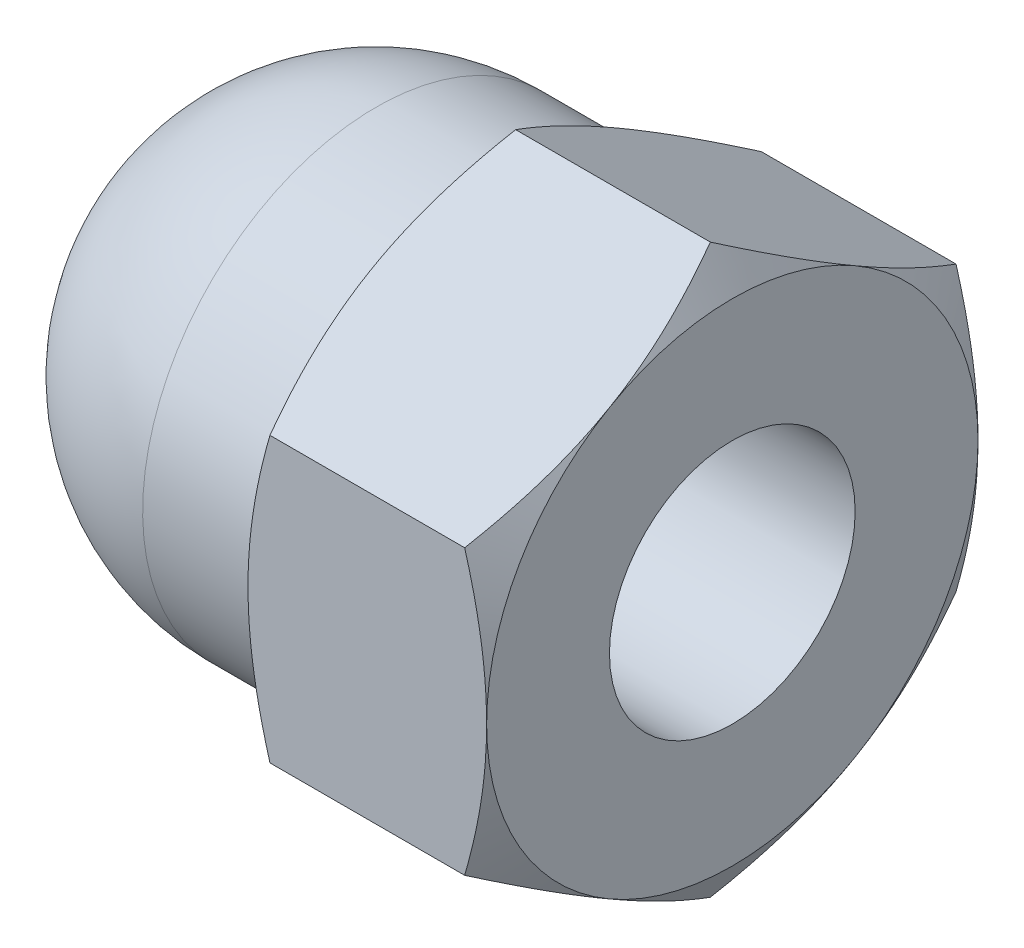
ISO-10303-21;
HEADER;
FILE_DESCRIPTION(('STEP AP214'),'2;1');
FILE_NAME('part.step','',(''),(''),'','','');
FILE_SCHEMA(('AUTOMOTIVE_DESIGN { 1 0 10303 214 1 1 1 1 }'));
ENDSEC;
DATA;
#1=APPLICATION_CONTEXT('core data for automotive mechanical design processes');
#2=APPLICATION_PROTOCOL_DEFINITION('international standard','automotive_design',2000,#1);
#3=PRODUCT_CONTEXT('',#1,'mechanical');
#4=PRODUCT('Part','Part','',(#3));
#5=PRODUCT_RELATED_PRODUCT_CATEGORY('part','',(#4));
#6=PRODUCT_DEFINITION_FORMATION('','',#4);
#7=PRODUCT_DEFINITION_CONTEXT('part definition',#1,'design');
#8=PRODUCT_DEFINITION('design','',#6,#7);
#9=PRODUCT_DEFINITION_SHAPE('','',#8);
#10=(LENGTH_UNIT() NAMED_UNIT(*) SI_UNIT(.MILLI.,.METRE.));
#11=(NAMED_UNIT(*) PLANE_ANGLE_UNIT() SI_UNIT($,.RADIAN.));
#12=(NAMED_UNIT(*) SI_UNIT($,.STERADIAN.) SOLID_ANGLE_UNIT());
#13=UNCERTAINTY_MEASURE_WITH_UNIT(LENGTH_MEASURE(1.E-05),#10,'distance_accuracy_value','');
#14=(GEOMETRIC_REPRESENTATION_CONTEXT(3) GLOBAL_UNCERTAINTY_ASSIGNED_CONTEXT((#13)) GLOBAL_UNIT_ASSIGNED_CONTEXT((#10,
#11,#12)) REPRESENTATION_CONTEXT('',''));
#15=CARTESIAN_POINT('',(0.,0.,0.));
#16=DIRECTION('',(0.,0.,1.));
#17=DIRECTION('',(1.,0.,0.));
#18=AXIS2_PLACEMENT_3D('',#15,#16,#17);
#19=CARTESIAN_POINT('',(-12.,2.88675134594813,-5.));
#20=DIRECTION('',(0.,0.866025403784438,-0.5));
#21=DIRECTION('',(0.,0.5,0.866025403784439));
#22=AXIS2_PLACEMENT_3D('',#19,#20,#21);
#23=PLANE('',#22);
#24=DIRECTION('',(1.,0.,0.));
#25=VECTOR('',#24,1.);
#26=CARTESIAN_POINT('',(-12.,5.77350269189626,0.));
#27=LINE('',#26,#25);
#28=CARTESIAN_POINT('',(-4.4090804453174,5.77350269189626,0.));
#29=VERTEX_POINT('',#28);
#30=CARTESIAN_POINT('',(-0.446581987385199,5.77350269189626,0.));
#31=VERTEX_POINT('',#30);
#32=EDGE_CURVE('E288',#29,#31,#27,.T.);
#33=ORIENTED_EDGE('',*,*,#32,.T.);
#34=CARTESIAN_POINT('',(-0.446648656051826,5.7736181619501,0.000199999999999086));
#35=CARTESIAN_POINT('',(-0.373386567637632,5.64675433465071,-0.219534594525186));
#36=CARTESIAN_POINT('',(-0.30675132191809,5.5188054379059,-0.441148584459581));
#37=CARTESIAN_POINT('',(-0.19043899101081,5.26069210252318,-0.888213995453514));
#38=CARTESIAN_POINT('',(-0.140803049915789,5.13052307794721,-1.11367335959077));
#39=CARTESIAN_POINT('',(-0.0635510254186985,4.87177839004641,-1.56183230522351));
#40=CARTESIAN_POINT('',(-0.0354203782834903,4.74324302208387,-1.78446209310419));
#41=CARTESIAN_POINT('',(-0.0101949219536855,4.54998783160116,-2.11918990184664));
#42=CARTESIAN_POINT('',(-0.00461345976948486,4.48552534905128,-2.23084219680506));
#43=CARTESIAN_POINT('',(0.000797783248528913,4.35654081066911,-2.4542499706738));
#44=CARTESIAN_POINT('',(0.000627741741795695,4.2920187567385,-2.56600544629031));
#45=CARTESIAN_POINT('',(-0.00775363179203751,4.11524635305245,-2.87218423085064));
#46=CARTESIAN_POINT('',(-0.0218297718972525,4.00305457769146,-3.06650608596721));
#47=CARTESIAN_POINT('',(-0.0664652571094314,3.77941563226458,-3.45386010199771));
#48=CARTESIAN_POINT('',(-0.0970398601475082,3.66796924828419,-3.64689090137157));
#49=CARTESIAN_POINT('',(-0.173468493621163,3.44387972423144,-4.03502534247485));
#50=CARTESIAN_POINT('',(-0.219646378878679,3.3312648659868,-4.23007999864174));
#51=CARTESIAN_POINT('',(-0.324451794491932,3.10771464157941,-4.61728034535877));
#52=CARTESIAN_POINT('',(-0.383054703437371,2.99677641204847,-4.80943099540809));
#53=CARTESIAN_POINT('',(-0.446648656051825,2.88663587589429,-5.0002));
#54=B_SPLINE_CURVE_WITH_KNOTS('',3,(#34,#35,#36,#37,#38,#39,#40,#41,#42,#43,#44,#45,#46,#47,#48,
#49,#50,#51,#52,#53),.UNSPECIFIED.,.F.,.F.,(4,2,2,2,2,2,2,2,2,4),(0.,0.792555841363091,
1.58701660053333,2.3618153748728,2.74884076077325,3.13585419177295,3.80962362599679,
4.48401723901189,5.17336882348928,5.86136694793725),.UNSPECIFIED.);
#55=CARTESIAN_POINT('',(0.,4.33012701892219,-2.5));
#56=VERTEX_POINT('',#55);
#57=EDGE_CURVE('E57',#31,#56,#54,.T.);
#58=ORIENTED_EDGE('',*,*,#57,.T.);
#59=CARTESIAN_POINT('',(-0.446581987385199,2.88675134594813,-5.));
#60=VERTEX_POINT('',#59);
#61=EDGE_CURVE('E191',#56,#60,#54,.T.);
#62=ORIENTED_EDGE('',*,*,#61,.T.);
#63=DIRECTION('',(1.,0.,0.));
#64=VECTOR('',#63,1.);
#65=CARTESIAN_POINT('',(-12.,2.88675134594813,-5.));
#66=LINE('',#65,#64);
#67=CARTESIAN_POINT('',(-4.4090804453174,2.88675134594813,-5.));
#68=VERTEX_POINT('',#67);
#69=EDGE_CURVE('E270',#68,#60,#66,.T.);
#70=ORIENTED_EDGE('',*,*,#69,.F.);
#71=CARTESIAN_POINT('',(-4.40901377665077,2.88663587589429,-5.0002));
#72=CARTESIAN_POINT('',(-4.48227586506497,3.01349970319368,-4.78046540547481));
#73=CARTESIAN_POINT('',(-4.54891111078451,3.14144859993849,-4.55885141554042));
#74=CARTESIAN_POINT('',(-4.66522344169179,3.39956193532121,-4.11178600454649));
#75=CARTESIAN_POINT('',(-4.71485938278681,3.52973095989718,-3.88632664040923));
#76=CARTESIAN_POINT('',(-4.7921114072839,3.78847564779798,-3.43816769477649));
#77=CARTESIAN_POINT('',(-4.82024205441911,3.91701101576052,-3.21553790689581));
#78=CARTESIAN_POINT('',(-4.84546751074891,4.11026620624323,-2.88081009815336));
#79=CARTESIAN_POINT('',(-4.85104897293311,4.17472868879311,-2.76915780319494));
#80=CARTESIAN_POINT('',(-4.85646021595113,4.30371322717528,-2.5457500293262));
#81=CARTESIAN_POINT('',(-4.85629017444439,4.36823528110589,-2.43399455370969));
#82=CARTESIAN_POINT('',(-4.84790880091056,4.54500768479194,-2.12781576914936));
#83=CARTESIAN_POINT('',(-4.83383266080534,4.65719946015293,-1.93349391403279));
#84=CARTESIAN_POINT('',(-4.78919717559317,4.88083840557981,-1.54613989800229));
#85=CARTESIAN_POINT('',(-4.75862257255509,4.9922847895602,-1.35310909862843));
#86=CARTESIAN_POINT('',(-4.68219393908143,5.21637431361295,-0.964974657525146));
#87=CARTESIAN_POINT('',(-4.63601605382392,5.32898917185759,-0.769920001358264));
#88=CARTESIAN_POINT('',(-4.53121063821067,5.55253939626498,-0.382719654641232));
#89=CARTESIAN_POINT('',(-4.47260772926523,5.66347762579592,-0.190569004591914));
#90=CARTESIAN_POINT('',(-4.40901377665077,5.7736181619501,0.00019999999999984));
#91=B_SPLINE_CURVE_WITH_KNOTS('',3,(#71,#72,#73,#74,#75,#76,#77,#78,#79,#80,#81,#82,#83,#84,#85,
#86,#87,#88,#89,#90),.UNSPECIFIED.,.F.,.F.,(4,2,2,2,2,2,2,2,2,4),(0.,0.792555841363089,
1.58701660053333,2.3618153748728,2.74884076077325,3.13585419177295,3.80962362599679,
4.48401723901189,5.17336882348928,5.86136694793725),.UNSPECIFIED.);
#92=EDGE_CURVE('E213',#68,#29,#91,.T.);
#93=ORIENTED_EDGE('',*,*,#92,.T.);
#94=EDGE_LOOP('',(#33,#58,#62,#70,#93));
#95=FACE_BOUND('',#94,.T.);
#96=ADVANCED_FACE('F35',(#95),#23,.T.);
#97=CARTESIAN_POINT('',(-12.,-2.88675134594813,-5.));
#98=DIRECTION('',(0.,0.,-1.));
#99=DIRECTION('',(-1.,0.,0.));
#100=AXIS2_PLACEMENT_3D('',#97,#98,#99);
#101=PLANE('',#100);
#102=ORIENTED_EDGE('',*,*,#69,.T.);
#103=CARTESIAN_POINT('',(-2.39263352655076,-7.65608998744865,-5.));
#104=CARTESIAN_POINT('',(-2.28654533817204,-7.43656171400166,-5.));
#105=CARTESIAN_POINT('',(-2.18151175461592,-7.21651440170021,-5.));
#106=CARTESIAN_POINT('',(-1.97415643363973,-6.77510105921518,-5.));
#107=CARTESIAN_POINT('',(-1.87183516574566,-6.55373480873052,-5.));
#108=CARTESIAN_POINT('',(-1.66996807853488,-6.10820714710357,-5.));
#109=CARTESIAN_POINT('',(-1.57044149281728,-5.88403698971124,-5.));
#110=CARTESIAN_POINT('',(-1.37566323278679,-5.43385418074677,-5.));
#111=CARTESIAN_POINT('',(-1.28041133564241,-5.20784162594278,-5.));
#112=CARTESIAN_POINT('',(-1.0941883091894,-4.75080884782756,-5.));
#113=CARTESIAN_POINT('',(-1.00328409099868,-4.51976121099505,-5.));
#114=CARTESIAN_POINT('',(-0.828595302971937,-4.05494053422099,-5.));
#115=CARTESIAN_POINT('',(-0.74481152524764,-3.82116719434024,-5.));
#116=CARTESIAN_POINT('',(-0.58661463236461,-3.35100416711889,-5.));
#117=CARTESIAN_POINT('',(-0.512181595225263,-3.11462125088187,-5.));
#118=CARTESIAN_POINT('',(-0.375104393872371,-2.63849247870023,-5.));
#119=CARTESIAN_POINT('',(-0.312456501596945,-2.3987477121033,-5.));
#120=CARTESIAN_POINT('',(-0.201987753994866,-1.91574303714497,-5.));
#121=CARTESIAN_POINT('',(-0.154170846558639,-1.672482210841,-5.));
#122=CARTESIAN_POINT('',(-0.0765955557924012,-1.18299359688664,-5.));
#123=CARTESIAN_POINT('',(-0.0468371884284084,-0.93676580661328,-5.));
#124=CARTESIAN_POINT('',(-0.017651201586296,-0.567032279323848,-5.));
#125=CARTESIAN_POINT('',(-0.0104963190599466,-0.44410529765854,-5.));
#126=CARTESIAN_POINT('',(-0.00139545226904074,-0.198053005238566,-5.));
#127=CARTESIAN_POINT('',(0.000550599639614402,-0.07492769708023,-5.));
#128=CARTESIAN_POINT('',(-0.000818470345663952,0.171257999892351,-5.));
#129=CARTESIAN_POINT('',(-0.00413211431301118,0.294318397227087,-5.));
#130=CARTESIAN_POINT('',(-0.0159365972827593,0.540192730788839,-5.));
#131=CARTESIAN_POINT('',(-0.0244276975701642,0.663006654263481,-5.));
#132=CARTESIAN_POINT('',(-0.0511063802753,0.960681872881668,-5.));
#133=CARTESIAN_POINT('',(-0.0718889676982854,1.1353143627994,-5.));
#134=CARTESIAN_POINT('',(-0.122765655722695,1.4832167579939,-5.));
#135=CARTESIAN_POINT('',(-0.152860997990034,1.65648647841238,-5.));
#136=CARTESIAN_POINT('',(-0.221298792011552,2.00155426058701,-5.));
#137=CARTESIAN_POINT('',(-0.259649477486406,2.17335067370375,-5.));
#138=CARTESIAN_POINT('',(-0.343428305385014,2.51518168221057,-5.));
#139=CARTESIAN_POINT('',(-0.388856016914005,2.68521638419314,-5.));
#140=CARTESIAN_POINT('',(-0.486887782054296,3.02770318928896,-5.));
#141=CARTESIAN_POINT('',(-0.539640363823946,3.20011248435316,-5.));
#142=CARTESIAN_POINT('',(-0.650357787302631,3.54310870430181,-5.));
#143=CARTESIAN_POINT('',(-0.708319033907076,3.71369679659719,-5.));
#144=CARTESIAN_POINT('',(-0.828256540728482,4.05236610267979,-5.));
#145=CARTESIAN_POINT('',(-0.890208365426374,4.22045602230062,-5.));
#146=CARTESIAN_POINT('',(-1.01774823413813,4.55533171687455,-5.));
#147=CARTESIAN_POINT('',(-1.08333774778778,4.72211693321421,-5.));
#148=CARTESIAN_POINT('',(-1.15038625817725,4.88829623733363,-5.));
#149=B_SPLINE_CURVE_WITH_KNOTS('',3,(#103,#104,#105,#106,#107,#108,#109,#110,#111,#112,#113,
#114,#115,#116,#117,#118,#119,#120,#121,#122,#123,#124,#125,#126,#127,#128,#129,#130,#131,#132,
#133,#134,#135,#136,#137,#138,#139,#140,#141,#142,#143,#144,#145,#146,#147,#148),.UNSPECIFIED.,
.F.,.F.,(4,2,2,2,2,2,2,2,2,2,2,2,2,2,2,2,2,2,2,2,2,2,4),(0.,0.731464740665348,1.46305528824908,
2.19883243307485,2.93457117856033,3.67934251246857,4.4241965901336,5.16743580871988,
5.91043951739337,6.65364083834805,7.39684281638514,7.76615414335455,8.13546067426609,
8.50466345177854,8.87388486298451,9.40118542949726,9.92855633110015,10.4564556797854,
10.9843228991235,11.525120280828,12.0655472210641,12.6029322754131,13.1405360390026),.UNSPECIFIED.);
#150=CARTESIAN_POINT('',(0.,0.,-5.));
#151=VERTEX_POINT('',#150);
#152=EDGE_CURVE('E190',#60,#151,#149,.F.);
#153=ORIENTED_EDGE('',*,*,#152,.T.);
#154=CARTESIAN_POINT('',(-0.446581987385199,-2.88675134594813,-5.));
#155=VERTEX_POINT('',#154);
#156=EDGE_CURVE('E184',#151,#155,#149,.F.);
#157=ORIENTED_EDGE('',*,*,#156,.T.);
#158=DIRECTION('',(1.,0.,0.));
#159=VECTOR('',#158,1.);
#160=CARTESIAN_POINT('',(-12.,-2.88675134594813,-5.));
#161=LINE('',#160,#159);
#162=CARTESIAN_POINT('',(-4.4090804453174,-2.88675134594813,-5.));
#163=VERTEX_POINT('',#162);
#164=EDGE_CURVE('E278',#163,#155,#161,.T.);
#165=ORIENTED_EDGE('',*,*,#164,.F.);
#166=CARTESIAN_POINT('',(-2.47269384044658,-7.63608831020962,-5.));
#167=CARTESIAN_POINT('',(-2.57862390183092,-7.41671502063001,-5.));
#168=CARTESIAN_POINT('',(-2.68349478183039,-7.19682078948626,-5.));
#169=CARTESIAN_POINT('',(-2.89051245252427,-6.75570867749105,-5.));
#170=CARTESIAN_POINT('',(-2.99265876692992,-6.53449057337866,-5.));
#171=CARTESIAN_POINT('',(-3.19416407605692,-6.08924401850543,-5.));
#172=CARTESIAN_POINT('',(-3.29350358500235,-5.86520671689426,-5.));
#173=CARTESIAN_POINT('',(-3.48788681354653,-5.41528330479419,-5.));
#174=CARTESIAN_POINT('',(-3.58293075860563,-5.18939729207492,-5.));
#175=CARTESIAN_POINT('',(-3.76866995068582,-4.73270635601579,-5.));
#176=CARTESIAN_POINT('',(-3.85930024186164,-4.5018748681938,-5.));
#177=CARTESIAN_POINT('',(-4.03341259035345,-4.03748213336677,-5.));
#178=CARTESIAN_POINT('',(-4.11689385072374,-3.80392058531511,-5.));
#179=CARTESIAN_POINT('',(-4.27445039275793,-3.33418257692391,-5.));
#180=CARTESIAN_POINT('',(-4.34854584795841,-3.09801295329933,-5.));
#181=CARTESIAN_POINT('',(-4.48491149564427,-2.622317210366,-5.));
#182=CARTESIAN_POINT('',(-4.54718544440377,-2.38279218329777,-5.));
#183=CARTESIAN_POINT('',(-4.6568740474413,-1.90021405498409,-5.));
#184=CARTESIAN_POINT('',(-4.70428368370942,-1.65715979122221,-5.));
#185=CARTESIAN_POINT('',(-4.78103450207166,-1.16814339899781,-5.));
#186=CARTESIAN_POINT('',(-4.81037564517254,-0.922181264261044,-5.));
#187=CARTESIAN_POINT('',(-4.84839332971893,-0.430179275668582,-5.));
#188=CARTESIAN_POINT('',(-4.85719859753235,-0.184149627388368,-5.));
#189=CARTESIAN_POINT('',(-4.8536856005624,0.307704322292011,-5.));
#190=CARTESIAN_POINT('',(-4.84137271657131,0.553528660038115,-5.));
#191=CARTESIAN_POINT('',(-4.80312768283988,0.973839544225615,-5.));
#192=CARTESIAN_POINT('',(-4.78204654009165,1.14879180614304,-5.));
#193=CARTESIAN_POINT('',(-4.73056856053817,1.49733080573963,-5.));
#194=CARTESIAN_POINT('',(-4.70017032427196,1.67091733426056,-5.));
#195=CARTESIAN_POINT('',(-4.59651358553406,2.18990458001968,-5.));
#196=CARTESIAN_POINT('',(-4.51086277239104,2.53285316893865,-5.));
#197=CARTESIAN_POINT('',(-4.36334580629891,3.04581132525505,-5.));
#198=CARTESIAN_POINT('',(-4.31028496058772,3.21850342236316,-5.));
#199=CARTESIAN_POINT('',(-4.19891367336076,3.56221900439277,-5.));
#200=CARTESIAN_POINT('',(-4.14060276088657,3.73324233808919,-5.));
#201=CARTESIAN_POINT('',(-4.01997787373215,4.07276682817564,-5.));
#202=CARTESIAN_POINT('',(-3.95768840201022,4.24127677843429,-5.));
#203=CARTESIAN_POINT('',(-3.82952844900996,4.57686542207983,-5.));
#204=CARTESIAN_POINT('',(-3.76365921145344,4.74394458950531,-5.));
#205=CARTESIAN_POINT('',(-3.69633577380418,4.91042173992309,-5.));
#206=B_SPLINE_CURVE_WITH_KNOTS('',3,(#166,#167,#168,#169,#170,#171,#172,#173,#174,#175,#176,
#177,#178,#179,#180,#181,#182,#183,#184,#185,#186,#187,#188,#189,#190,#191,#192,#193,#194,#195,
#196,#197,#198,#199,#200,#201,#202,#203,#204,#205),.UNSPECIFIED.,.F.,.F.,(4,2,2,2,2,2,2,2,2,2,2,
2,2,2,2,2,2,2,2,4),(0.,0.730839835481473,1.46180660468968,2.19699145656865,2.93213767603387,
3.67600400363848,4.4199531468705,5.16227511291297,5.90436081048045,6.64669675802214,
7.38903430757833,8.12670595994832,8.8641896854429,9.39258492676547,9.92105957388046,
10.9800497280791,11.5219872993396,12.0639735337611,12.602894729619,13.1416298698482),.UNSPECIFIED.);
#207=EDGE_CURVE('E206',#163,#68,#206,.T.);
#208=ORIENTED_EDGE('',*,*,#207,.T.);
#209=EDGE_LOOP('',(#102,#153,#157,#165,#208));
#210=FACE_BOUND('',#209,.T.);
#211=ADVANCED_FACE('F196',(#210),#101,.T.);
#212=CARTESIAN_POINT('',(-12.,-5.77350269189626,0.));
#213=DIRECTION('',(0.,-0.866025403784439,-0.5));
#214=DIRECTION('',(0.,0.5,-0.866025403784439));
#215=AXIS2_PLACEMENT_3D('',#212,#213,#214);
#216=PLANE('',#215);
#217=ORIENTED_EDGE('',*,*,#164,.T.);
#218=CARTESIAN_POINT('',(-0.446648656051825,-2.88663587589429,-5.0002));
#219=CARTESIAN_POINT('',(-0.373386567637632,-3.01349970319368,-4.78046540547481));
#220=CARTESIAN_POINT('',(-0.306751321918089,-3.14144859993849,-4.55885141554042));
#221=CARTESIAN_POINT('',(-0.190438991010809,-3.39956193532121,-4.11178600454649));
#222=CARTESIAN_POINT('',(-0.140803049915788,-3.52973095989718,-3.88632664040923));
#223=CARTESIAN_POINT('',(-0.0635510254186975,-3.78847564779798,-3.43816769477649));
#224=CARTESIAN_POINT('',(-0.0354203782834891,-3.91701101576052,-3.21553790689581));
#225=CARTESIAN_POINT('',(-0.0101949219536845,-4.11026620624323,-2.88081009815336));
#226=CARTESIAN_POINT('',(-0.00461345976948401,-4.17472868879311,-2.76915780319494));
#227=CARTESIAN_POINT('',(0.000797783248529582,-4.30371322717528,-2.5457500293262));
#228=CARTESIAN_POINT('',(0.000627741741796332,-4.36823528110589,-2.43399455370969));
#229=CARTESIAN_POINT('',(-0.00775363179203685,-4.54500768479194,-2.12781576914936));
#230=CARTESIAN_POINT('',(-0.0218297718972517,-4.65719946015292,-1.93349391403279));
#231=CARTESIAN_POINT('',(-0.0664652571094305,-4.88083840557981,-1.54613989800229));
#232=CARTESIAN_POINT('',(-0.0970398601475075,-4.9922847895602,-1.35310909862843));
#233=CARTESIAN_POINT('',(-0.173468493621163,-5.21637431361295,-0.964974657525145));
#234=CARTESIAN_POINT('',(-0.219646378878679,-5.32898917185759,-0.769920001358264));
#235=CARTESIAN_POINT('',(-0.324451794491932,-5.55253939626498,-0.382719654641232));
#236=CARTESIAN_POINT('',(-0.383054703437371,-5.66347762579592,-0.190569004591913));
#237=CARTESIAN_POINT('',(-0.446648656051825,-5.7736181619501,0.000200000000000144));
#238=B_SPLINE_CURVE_WITH_KNOTS('',3,(#218,#219,#220,#221,#222,#223,#224,#225,#226,#227,#228,
#229,#230,#231,#232,#233,#234,#235,#236,#237),.UNSPECIFIED.,.F.,.F.,(4,2,2,2,2,2,2,2,2,4),(0.,
0.792555841363091,1.58701660053333,2.3618153748728,2.74884076077325,3.13585419177295,
3.80962362599679,4.48401723901189,5.17336882348928,5.86136694793725),.UNSPECIFIED.);
#239=CARTESIAN_POINT('',(0.,-4.33012701892219,-2.5));
#240=VERTEX_POINT('',#239);
#241=EDGE_CURVE('E147',#155,#240,#238,.T.);
#242=ORIENTED_EDGE('',*,*,#241,.T.);
#243=CARTESIAN_POINT('',(-0.446581987385199,-5.77350269189626,0.));
#244=VERTEX_POINT('',#243);
#245=EDGE_CURVE('E131',#240,#244,#238,.T.);
#246=ORIENTED_EDGE('',*,*,#245,.T.);
#247=DIRECTION('',(1.,0.,0.));
#248=VECTOR('',#247,1.);
#249=CARTESIAN_POINT('',(-12.,-5.77350269189626,0.));
#250=LINE('',#249,#248);
#251=CARTESIAN_POINT('',(-4.4090804453174,-5.77350269189626,0.));
#252=VERTEX_POINT('',#251);
#253=EDGE_CURVE('E146',#252,#244,#250,.T.);
#254=ORIENTED_EDGE('',*,*,#253,.F.);
#255=CARTESIAN_POINT('',(-4.40901377665077,-5.7736181619501,0.000200000000000029));
#256=CARTESIAN_POINT('',(-4.48227586506497,-5.64675433465071,-0.219534594525185));
#257=CARTESIAN_POINT('',(-4.54891111078451,-5.5188054379059,-0.44114858445958));
#258=CARTESIAN_POINT('',(-4.66522344169179,-5.26069210252318,-0.888213995453513));
#259=CARTESIAN_POINT('',(-4.71485938278681,-5.13052307794721,-1.11367335959077));
#260=CARTESIAN_POINT('',(-4.7921114072839,-4.87177839004641,-1.56183230522351));
#261=CARTESIAN_POINT('',(-4.82024205441911,-4.74324302208387,-1.78446209310419));
#262=CARTESIAN_POINT('',(-4.84546751074891,-4.54998783160116,-2.11918990184664));
#263=CARTESIAN_POINT('',(-4.85104897293311,-4.48552534905128,-2.23084219680506));
#264=CARTESIAN_POINT('',(-4.85646021595113,-4.35654081066911,-2.4542499706738));
#265=CARTESIAN_POINT('',(-4.85629017444439,-4.2920187567385,-2.56600544629031));
#266=CARTESIAN_POINT('',(-4.84790880091056,-4.11524635305244,-2.87218423085064));
#267=CARTESIAN_POINT('',(-4.83383266080535,-4.00305457769146,-3.06650608596721));
#268=CARTESIAN_POINT('',(-4.78919717559317,-3.77941563226458,-3.4538601019977));
#269=CARTESIAN_POINT('',(-4.75862257255509,-3.66796924828419,-3.64689090137157));
#270=CARTESIAN_POINT('',(-4.68219393908144,-3.44387972423144,-4.03502534247485));
#271=CARTESIAN_POINT('',(-4.63601605382392,-3.3312648659868,-4.23007999864173));
#272=CARTESIAN_POINT('',(-4.53121063821067,-3.10771464157941,-4.61728034535877));
#273=CARTESIAN_POINT('',(-4.47260772926523,-2.99677641204847,-4.80943099540809));
#274=CARTESIAN_POINT('',(-4.40901377665077,-2.88663587589429,-5.0002));
#275=B_SPLINE_CURVE_WITH_KNOTS('',3,(#255,#256,#257,#258,#259,#260,#261,#262,#263,#264,#265,
#266,#267,#268,#269,#270,#271,#272,#273,#274),.UNSPECIFIED.,.F.,.F.,(4,2,2,2,2,2,2,2,2,4),(0.,
0.79255584136309,1.58701660053333,2.3618153748728,2.74884076077325,3.13585419177295,
3.80962362599679,4.48401723901189,5.17336882348928,5.86136694793725),.UNSPECIFIED.);
#276=EDGE_CURVE('E214',#252,#163,#275,.T.);
#277=ORIENTED_EDGE('',*,*,#276,.T.);
#278=EDGE_LOOP('',(#217,#242,#246,#254,#277));
#279=FACE_BOUND('',#278,.T.);
#280=ADVANCED_FACE('F200',(#279),#216,.T.);
#281=CARTESIAN_POINT('',(-12.,-2.88675134594813,5.));
#282=DIRECTION('',(0.,-0.866025403784438,0.5));
#283=DIRECTION('',(0.,-0.5,-0.866025403784439));
#284=AXIS2_PLACEMENT_3D('',#281,#282,#283);
#285=PLANE('',#284);
#286=ORIENTED_EDGE('',*,*,#253,.T.);
#287=CARTESIAN_POINT('',(-0.446648656051825,-5.77361816195009,-0.000199999999999971));
#288=CARTESIAN_POINT('',(-0.373386567637631,-5.64675433465071,0.219534594525186));
#289=CARTESIAN_POINT('',(-0.306751321918089,-5.5188054379059,0.441148584459581));
#290=CARTESIAN_POINT('',(-0.190438991010809,-5.26069210252318,0.888213995453513));
#291=CARTESIAN_POINT('',(-0.140803049915788,-5.13052307794721,1.11367335959077));
#292=CARTESIAN_POINT('',(-0.0635510254186974,-4.87177839004641,1.56183230522351));
#293=CARTESIAN_POINT('',(-0.035420378283489,-4.74324302208387,1.78446209310419));
#294=CARTESIAN_POINT('',(-0.010194921953684,-4.54998783160116,2.11918990184664));
#295=CARTESIAN_POINT('',(-0.00461345976948343,-4.48552534905128,2.23084219680506));
#296=CARTESIAN_POINT('',(0.000797783248530321,-4.35654081066911,2.4542499706738));
#297=CARTESIAN_POINT('',(0.000627741741797093,-4.2920187567385,2.56600544629031));
#298=CARTESIAN_POINT('',(-0.00775363179203609,-4.11524635305244,2.87218423085064));
#299=CARTESIAN_POINT('',(-0.021829771897251,-4.00305457769146,3.06650608596721));
#300=CARTESIAN_POINT('',(-0.0664652571094299,-3.77941563226457,3.4538601019977));
#301=CARTESIAN_POINT('',(-0.0970398601475068,-3.66796924828418,3.64689090137157));
#302=CARTESIAN_POINT('',(-0.173468493621162,-3.44387972423144,4.03502534247485));
#303=CARTESIAN_POINT('',(-0.219646378878678,-3.3312648659868,4.23007999864173));
#304=CARTESIAN_POINT('',(-0.324451794491931,-3.1077146415794,4.61728034535877));
#305=CARTESIAN_POINT('',(-0.38305470343737,-2.99677641204847,4.80943099540809));
#306=CARTESIAN_POINT('',(-0.446648656051825,-2.88663587589429,5.0002));
#307=B_SPLINE_CURVE_WITH_KNOTS('',3,(#287,#288,#289,#290,#291,#292,#293,#294,#295,#296,#297,
#298,#299,#300,#301,#302,#303,#304,#305,#306),.UNSPECIFIED.,.F.,.F.,(4,2,2,2,2,2,2,2,2,4),(0.,
0.792555841363089,1.58701660053333,2.3618153748728,2.74884076077325,3.13585419177295,
3.80962362599679,4.48401723901189,5.17336882348928,5.86136694793725),.UNSPECIFIED.);
#308=CARTESIAN_POINT('',(0.,-4.33012701892219,2.5));
#309=VERTEX_POINT('',#308);
#310=EDGE_CURVE('E124',#244,#309,#307,.T.);
#311=ORIENTED_EDGE('',*,*,#310,.T.);
#312=CARTESIAN_POINT('',(-0.446581987385199,-2.88675134594813,5.));
#313=VERTEX_POINT('',#312);
#314=EDGE_CURVE('E112',#309,#313,#307,.T.);
#315=ORIENTED_EDGE('',*,*,#314,.T.);
#316=DIRECTION('',(1.,0.,0.));
#317=VECTOR('',#316,1.);
#318=CARTESIAN_POINT('',(-12.,-2.88675134594813,5.));
#319=LINE('',#318,#317);
#320=CARTESIAN_POINT('',(-4.4090804453174,-2.88675134594813,5.));
#321=VERTEX_POINT('',#320);
#322=EDGE_CURVE('E285',#321,#313,#319,.T.);
#323=ORIENTED_EDGE('',*,*,#322,.F.);
#324=CARTESIAN_POINT('',(-4.40901377665077,-2.88663587589429,5.0002));
#325=CARTESIAN_POINT('',(-4.48227586506497,-3.01349970319368,4.78046540547481));
#326=CARTESIAN_POINT('',(-4.54891111078451,-3.14144859993849,4.55885141554042));
#327=CARTESIAN_POINT('',(-4.66522344169179,-3.39956193532121,4.11178600454649));
#328=CARTESIAN_POINT('',(-4.71485938278681,-3.52973095989717,3.88632664040923));
#329=CARTESIAN_POINT('',(-4.7921114072839,-3.78847564779797,3.43816769477649));
#330=CARTESIAN_POINT('',(-4.82024205441911,-3.91701101576052,3.21553790689581));
#331=CARTESIAN_POINT('',(-4.84546751074891,-4.11026620624322,2.88081009815336));
#332=CARTESIAN_POINT('',(-4.85104897293311,-4.17472868879311,2.76915780319494));
#333=CARTESIAN_POINT('',(-4.85646021595113,-4.30371322717528,2.5457500293262));
#334=CARTESIAN_POINT('',(-4.85629017444439,-4.36823528110588,2.43399455370969));
#335=CARTESIAN_POINT('',(-4.84790880091056,-4.54500768479194,2.12781576914936));
#336=CARTESIAN_POINT('',(-4.83383266080535,-4.65719946015292,1.93349391403279));
#337=CARTESIAN_POINT('',(-4.78919717559317,-4.88083840557981,1.5461398980023));
#338=CARTESIAN_POINT('',(-4.75862257255509,-4.9922847895602,1.35310909862843));
#339=CARTESIAN_POINT('',(-4.68219393908144,-5.21637431361295,0.964974657525148));
#340=CARTESIAN_POINT('',(-4.63601605382392,-5.32898917185759,0.769920001358266));
#341=CARTESIAN_POINT('',(-4.53121063821067,-5.55253939626498,0.382719654641233));
#342=CARTESIAN_POINT('',(-4.47260772926523,-5.66347762579592,0.190569004591915));
#343=CARTESIAN_POINT('',(-4.40901377665077,-5.77361816195009,-0.000199999999999269));
#344=B_SPLINE_CURVE_WITH_KNOTS('',3,(#324,#325,#326,#327,#328,#329,#330,#331,#332,#333,#334,
#335,#336,#337,#338,#339,#340,#341,#342,#343),.UNSPECIFIED.,.F.,.F.,(4,2,2,2,2,2,2,2,2,4),(0.,
0.79255584136309,1.58701660053333,2.3618153748728,2.74884076077325,3.13585419177295,
3.80962362599679,4.48401723901189,5.17336882348928,5.86136694793725),.UNSPECIFIED.);
#345=EDGE_CURVE('E246',#321,#252,#344,.T.);
#346=ORIENTED_EDGE('',*,*,#345,.T.);
#347=EDGE_LOOP('',(#286,#311,#315,#323,#346));
#348=FACE_BOUND('',#347,.T.);
#349=ADVANCED_FACE('F143',(#348),#285,.T.);
#350=CARTESIAN_POINT('',(-12.,2.88675134594813,5.));
#351=DIRECTION('',(0.,0.,1.));
#352=DIRECTION('',(0.,-1.,0.));
#353=AXIS2_PLACEMENT_3D('',#350,#351,#352);
#354=PLANE('',#353);
#355=ORIENTED_EDGE('',*,*,#322,.T.);
#356=CARTESIAN_POINT('',(-2.39263352655076,-7.65608998744864,5.));
#357=CARTESIAN_POINT('',(-2.28654533817204,-7.43656171400166,5.));
#358=CARTESIAN_POINT('',(-2.18151175461592,-7.21651440170021,5.));
#359=CARTESIAN_POINT('',(-1.97415643363973,-6.77510105921518,5.));
#360=CARTESIAN_POINT('',(-1.87183516574565,-6.55373480873052,5.));
#361=CARTESIAN_POINT('',(-1.66996807853488,-6.10820714710356,5.));
#362=CARTESIAN_POINT('',(-1.57044149281728,-5.88403698971124,5.));
#363=CARTESIAN_POINT('',(-1.37566323278679,-5.43385418074676,5.));
#364=CARTESIAN_POINT('',(-1.28041133564241,-5.20784162594277,5.));
#365=CARTESIAN_POINT('',(-1.0941883091894,-4.75080884782755,5.));
#366=CARTESIAN_POINT('',(-1.00328409099868,-4.51976121099504,5.));
#367=CARTESIAN_POINT('',(-0.828595302971936,-4.05494053422099,5.));
#368=CARTESIAN_POINT('',(-0.744811525247639,-3.82116719434024,5.));
#369=CARTESIAN_POINT('',(-0.586614632364609,-3.35100416711888,5.));
#370=CARTESIAN_POINT('',(-0.512181595225262,-3.11462125088187,5.));
#371=CARTESIAN_POINT('',(-0.375104393872371,-2.63849247870023,5.));
#372=CARTESIAN_POINT('',(-0.312456501596944,-2.3987477121033,5.));
#373=CARTESIAN_POINT('',(-0.201987753994865,-1.91574303714496,5.));
#374=CARTESIAN_POINT('',(-0.154170846558639,-1.67248221084099,5.));
#375=CARTESIAN_POINT('',(-0.0765955557924015,-1.18299359688664,5.));
#376=CARTESIAN_POINT('',(-0.0468371884284089,-0.936765806613277,5.));
#377=CARTESIAN_POINT('',(-0.0176512015862968,-0.567032279323845,5.));
#378=CARTESIAN_POINT('',(-0.0104963190599474,-0.444105297658537,5.));
#379=CARTESIAN_POINT('',(-0.00139545226904144,-0.198053005238563,5.));
#380=CARTESIAN_POINT('',(0.000550599639613804,-0.0749276970802275,5.));
#381=CARTESIAN_POINT('',(-0.000818470345664792,0.171257999892354,5.));
#382=CARTESIAN_POINT('',(-0.00413211431301237,0.294318397227089,5.));
#383=CARTESIAN_POINT('',(-0.0159365972827607,0.540192730788841,5.));
#384=CARTESIAN_POINT('',(-0.0244276975701655,0.663006654263484,5.));
#385=CARTESIAN_POINT('',(-0.0511063802753014,0.96068187288167,5.));
#386=CARTESIAN_POINT('',(-0.0718889676982872,1.1353143627994,5.));
#387=CARTESIAN_POINT('',(-0.122765655722697,1.4832167579939,5.));
#388=CARTESIAN_POINT('',(-0.152860997990036,1.65648647841238,5.));
#389=CARTESIAN_POINT('',(-0.221298792011554,2.00155426058701,5.));
#390=CARTESIAN_POINT('',(-0.259649477486408,2.17335067370376,5.));
#391=CARTESIAN_POINT('',(-0.343428305385016,2.51518168221057,5.));
#392=CARTESIAN_POINT('',(-0.388856016914007,2.68521638419314,5.));
#393=CARTESIAN_POINT('',(-0.486887782054299,3.02770318928896,5.));
#394=CARTESIAN_POINT('',(-0.53964036382395,3.20011248435316,5.));
#395=CARTESIAN_POINT('',(-0.650357787302635,3.54310870430182,5.));
#396=CARTESIAN_POINT('',(-0.708319033907079,3.7136967965972,5.));
#397=CARTESIAN_POINT('',(-0.828256540728485,4.0523661026798,5.));
#398=CARTESIAN_POINT('',(-0.890208365426376,4.22045602230062,5.));
#399=CARTESIAN_POINT('',(-1.01774823413813,4.55533171687455,5.));
#400=CARTESIAN_POINT('',(-1.08333774778779,4.72211693321422,5.));
#401=CARTESIAN_POINT('',(-1.15038625817726,4.88829623733363,5.));
#402=B_SPLINE_CURVE_WITH_KNOTS('',3,(#356,#357,#358,#359,#360,#361,#362,#363,#364,#365,#366,
#367,#368,#369,#370,#371,#372,#373,#374,#375,#376,#377,#378,#379,#380,#381,#382,#383,#384,#385,
#386,#387,#388,#389,#390,#391,#392,#393,#394,#395,#396,#397,#398,#399,#400,#401),.UNSPECIFIED.,
.F.,.F.,(4,2,2,2,2,2,2,2,2,2,2,2,2,2,2,2,2,2,2,2,2,2,4),(0.,0.731464740665351,1.46305528824908,
2.19883243307485,2.93457117856033,3.67934251246857,4.4241965901336,5.16743580871988,
5.91043951739337,6.65364083834805,7.39684281638514,7.76615414335455,8.13546067426609,
8.50466345177854,8.87388486298451,9.40118542949726,9.92855633110015,10.4564556797854,
10.9843228991235,11.525120280828,12.0655472210641,12.6029322754131,13.1405360390026),.UNSPECIFIED.);
#403=CARTESIAN_POINT('',(0.,0.,5.));
#404=VERTEX_POINT('',#403);
#405=EDGE_CURVE('E119',#313,#404,#402,.T.);
#406=ORIENTED_EDGE('',*,*,#405,.T.);
#407=CARTESIAN_POINT('',(-0.446581987385199,2.88675134594813,5.));
#408=VERTEX_POINT('',#407);
#409=EDGE_CURVE('E155',#404,#408,#402,.T.);
#410=ORIENTED_EDGE('',*,*,#409,.T.);
#411=DIRECTION('',(1.,0.,0.));
#412=VECTOR('',#411,1.);
#413=CARTESIAN_POINT('',(-12.,2.88675134594813,5.));
#414=LINE('',#413,#412);
#415=CARTESIAN_POINT('',(-4.4090804453174,2.88675134594813,5.));
#416=VERTEX_POINT('',#415);
#417=EDGE_CURVE('E287',#416,#408,#414,.T.);
#418=ORIENTED_EDGE('',*,*,#417,.F.);
#419=CARTESIAN_POINT('',(-2.47269384044658,-7.63608831020962,5.));
#420=CARTESIAN_POINT('',(-2.57862390183093,-7.41671502063001,5.));
#421=CARTESIAN_POINT('',(-2.68349478183039,-7.19682078948626,5.));
#422=CARTESIAN_POINT('',(-2.89051245252427,-6.75570867749105,5.));
#423=CARTESIAN_POINT('',(-2.99265876692992,-6.53449057337866,5.));
#424=CARTESIAN_POINT('',(-3.19416407605692,-6.08924401850543,5.));
#425=CARTESIAN_POINT('',(-3.29350358500235,-5.86520671689426,5.));
#426=CARTESIAN_POINT('',(-3.48788681354653,-5.41528330479419,5.));
#427=CARTESIAN_POINT('',(-3.58293075860563,-5.18939729207492,5.));
#428=CARTESIAN_POINT('',(-3.76866995068582,-4.73270635601579,5.));
#429=CARTESIAN_POINT('',(-3.85930024186164,-4.5018748681938,5.));
#430=CARTESIAN_POINT('',(-4.03341259035345,-4.03748213336677,5.));
#431=CARTESIAN_POINT('',(-4.11689385072373,-3.80392058531511,5.));
#432=CARTESIAN_POINT('',(-4.27445039275793,-3.33418257692391,5.));
#433=CARTESIAN_POINT('',(-4.34854584795841,-3.09801295329933,5.));
#434=CARTESIAN_POINT('',(-4.48491149564427,-2.622317210366,5.));
#435=CARTESIAN_POINT('',(-4.54718544440377,-2.38279218329777,5.));
#436=CARTESIAN_POINT('',(-4.6568740474413,-1.90021405498409,5.));
#437=CARTESIAN_POINT('',(-4.70428368370942,-1.6571597912222,5.));
#438=CARTESIAN_POINT('',(-4.78103450207166,-1.1681433989978,5.));
#439=CARTESIAN_POINT('',(-4.81037564517254,-0.922181264261039,5.));
#440=CARTESIAN_POINT('',(-4.84839332971893,-0.430179275668578,5.));
#441=CARTESIAN_POINT('',(-4.85719859753234,-0.184149627388364,5.));
#442=CARTESIAN_POINT('',(-4.8536856005624,0.307704322292015,5.));
#443=CARTESIAN_POINT('',(-4.8413727165713,0.553528660038119,5.));
#444=CARTESIAN_POINT('',(-4.80312768283988,0.973839544225618,5.));
#445=CARTESIAN_POINT('',(-4.78204654009165,1.14879180614304,5.));
#446=CARTESIAN_POINT('',(-4.73056856053817,1.49733080573964,5.));
#447=CARTESIAN_POINT('',(-4.70017032427196,1.67091733426056,5.));
#448=CARTESIAN_POINT('',(-4.59651358553406,2.18990458001968,5.));
#449=CARTESIAN_POINT('',(-4.51086277239104,2.53285316893866,5.));
#450=CARTESIAN_POINT('',(-4.36334580629891,3.04581132525505,5.));
#451=CARTESIAN_POINT('',(-4.31028496058772,3.21850342236316,5.));
#452=CARTESIAN_POINT('',(-4.19891367336076,3.56221900439278,5.));
#453=CARTESIAN_POINT('',(-4.14060276088657,3.7332423380892,5.));
#454=CARTESIAN_POINT('',(-4.01997787373214,4.07276682817565,5.));
#455=CARTESIAN_POINT('',(-3.95768840201022,4.24127677843429,5.));
#456=CARTESIAN_POINT('',(-3.82952844900996,4.57686542207984,5.));
#457=CARTESIAN_POINT('',(-3.76365921145344,4.74394458950532,5.));
#458=CARTESIAN_POINT('',(-3.69633577380418,4.91042173992309,5.));
#459=B_SPLINE_CURVE_WITH_KNOTS('',3,(#419,#420,#421,#422,#423,#424,#425,#426,#427,#428,#429,
#430,#431,#432,#433,#434,#435,#436,#437,#438,#439,#440,#441,#442,#443,#444,#445,#446,#447,#448,
#449,#450,#451,#452,#453,#454,#455,#456,#457,#458),.UNSPECIFIED.,.F.,.F.,(4,2,2,2,2,2,2,2,2,2,2,
2,2,2,2,2,2,2,2,4),(0.,0.730839835481472,1.46180660468968,2.19699145656864,2.93213767603387,
3.67600400363847,4.4199531468705,5.16227511291297,5.90436081048045,6.64669675802214,
7.38903430757833,8.12670595994832,8.8641896854429,9.39258492676547,9.92105957388046,
10.9800497280791,11.5219872993396,12.0639735337611,12.602894729619,13.1416298698482),.UNSPECIFIED.);
#460=EDGE_CURVE('E240',#416,#321,#459,.F.);
#461=ORIENTED_EDGE('',*,*,#460,.T.);
#462=EDGE_LOOP('',(#355,#406,#410,#418,#461));
#463=FACE_BOUND('',#462,.T.);
#464=ADVANCED_FACE('F300',(#463),#354,.T.);
#465=CARTESIAN_POINT('',(-12.,5.77350269189626,0.));
#466=DIRECTION('',(0.,0.866025403784439,0.5));
#467=DIRECTION('',(0.,-0.5,0.866025403784439));
#468=AXIS2_PLACEMENT_3D('',#465,#466,#467);
#469=PLANE('',#468);
#470=ORIENTED_EDGE('',*,*,#417,.T.);
#471=CARTESIAN_POINT('',(-0.446648656051826,2.88663587589429,5.0002));
#472=CARTESIAN_POINT('',(-0.373386567637633,3.01349970319368,4.78046540547482));
#473=CARTESIAN_POINT('',(-0.306751321918091,3.14144859993849,4.55885141554042));
#474=CARTESIAN_POINT('',(-0.19043899101081,3.39956193532121,4.11178600454649));
#475=CARTESIAN_POINT('',(-0.140803049915789,3.52973095989718,3.88632664040923));
#476=CARTESIAN_POINT('',(-0.0635510254186983,3.78847564779798,3.43816769477649));
#477=CARTESIAN_POINT('',(-0.0354203782834901,3.91701101576052,3.21553790689581));
#478=CARTESIAN_POINT('',(-0.0101949219536851,4.11026620624323,2.88081009815336));
#479=CARTESIAN_POINT('',(-0.00461345976948439,4.17472868879311,2.76915780319494));
#480=CARTESIAN_POINT('',(0.000797783248529163,4.30371322717528,2.5457500293262));
#481=CARTESIAN_POINT('',(0.000627741741795647,4.36823528110589,2.43399455370969));
#482=CARTESIAN_POINT('',(-0.00775363179203775,4.54500768479194,2.12781576914936));
#483=CARTESIAN_POINT('',(-0.0218297718972522,4.65719946015293,1.93349391403279));
#484=CARTESIAN_POINT('',(-0.0664652571094308,4.88083840557981,1.54613989800229));
#485=CARTESIAN_POINT('',(-0.097039860147508,4.9922847895602,1.35310909862843));
#486=CARTESIAN_POINT('',(-0.173468493621163,5.21637431361295,0.964974657525145));
#487=CARTESIAN_POINT('',(-0.219646378878679,5.32898917185759,0.769920001358263));
#488=CARTESIAN_POINT('',(-0.324451794491932,5.55253939626498,0.38271965464123));
#489=CARTESIAN_POINT('',(-0.383054703437372,5.66347762579592,0.190569004591912));
#490=CARTESIAN_POINT('',(-0.446648656051826,5.7736181619501,-0.000200000000001038));
#491=B_SPLINE_CURVE_WITH_KNOTS('',3,(#471,#472,#473,#474,#475,#476,#477,#478,#479,#480,#481,
#482,#483,#484,#485,#486,#487,#488,#489,#490),.UNSPECIFIED.,.F.,.F.,(4,2,2,2,2,2,2,2,2,4),(0.,
0.792555841363089,1.58701660053333,2.3618153748728,2.74884076077325,3.13585419177295,
3.80962362599679,4.48401723901189,5.17336882348929,5.86136694793725),.UNSPECIFIED.);
#492=CARTESIAN_POINT('',(0.,4.33012701892219,2.5));
#493=VERTEX_POINT('',#492);
#494=EDGE_CURVE('E298',#408,#493,#491,.T.);
#495=ORIENTED_EDGE('',*,*,#494,.T.);
#496=EDGE_CURVE('E140',#493,#31,#491,.T.);
#497=ORIENTED_EDGE('',*,*,#496,.T.);
#498=ORIENTED_EDGE('',*,*,#32,.F.);
#499=CARTESIAN_POINT('',(-4.40901377665077,5.7736181619501,-0.000200000000001039));
#500=CARTESIAN_POINT('',(-4.48227586506497,5.64675433465071,0.219534594525184));
#501=CARTESIAN_POINT('',(-4.54891111078451,5.5188054379059,0.441148584459579));
#502=CARTESIAN_POINT('',(-4.66522344169179,5.26069210252318,0.888213995453512));
#503=CARTESIAN_POINT('',(-4.71485938278681,5.13052307794721,1.11367335959077));
#504=CARTESIAN_POINT('',(-4.7921114072839,4.87177839004641,1.56183230522351));
#505=CARTESIAN_POINT('',(-4.82024205441911,4.74324302208387,1.78446209310419));
#506=CARTESIAN_POINT('',(-4.84546751074891,4.54998783160116,2.11918990184664));
#507=CARTESIAN_POINT('',(-4.85104897293311,4.48552534905128,2.23084219680506));
#508=CARTESIAN_POINT('',(-4.85646021595113,4.35654081066911,2.4542499706738));
#509=CARTESIAN_POINT('',(-4.85629017444439,4.2920187567385,2.56600544629031));
#510=CARTESIAN_POINT('',(-4.84790880091056,4.11524635305245,2.87218423085064));
#511=CARTESIAN_POINT('',(-4.83383266080534,4.00305457769146,3.06650608596721));
#512=CARTESIAN_POINT('',(-4.78919717559317,3.77941563226458,3.4538601019977));
#513=CARTESIAN_POINT('',(-4.75862257255509,3.66796924828419,3.64689090137157));
#514=CARTESIAN_POINT('',(-4.68219393908143,3.44387972423144,4.03502534247485));
#515=CARTESIAN_POINT('',(-4.63601605382392,3.3312648659868,4.23007999864173));
#516=CARTESIAN_POINT('',(-4.53121063821066,3.10771464157941,4.61728034535877));
#517=CARTESIAN_POINT('',(-4.47260772926523,2.99677641204847,4.80943099540809));
#518=CARTESIAN_POINT('',(-4.40901377665077,2.88663587589429,5.0002));
#519=B_SPLINE_CURVE_WITH_KNOTS('',3,(#499,#500,#501,#502,#503,#504,#505,#506,#507,#508,#509,
#510,#511,#512,#513,#514,#515,#516,#517,#518),.UNSPECIFIED.,.F.,.F.,(4,2,2,2,2,2,2,2,2,4),(0.,
0.792555841363091,1.58701660053333,2.3618153748728,2.74884076077325,3.13585419177295,
3.80962362599679,4.48401723901189,5.17336882348928,5.86136694793725),.UNSPECIFIED.);
#520=EDGE_CURVE('E232',#29,#416,#519,.T.);
#521=ORIENTED_EDGE('',*,*,#520,.T.);
#522=EDGE_LOOP('',(#470,#495,#497,#498,#521));
#523=FACE_BOUND('',#522,.T.);
#524=ADVANCED_FACE('F297',(#523),#469,.T.);
#525=CARTESIAN_POINT('',(-7.25,0.,0.));
#526=DIRECTION('',(-1.,0.,0.));
#527=DIRECTION('',(0.,-1.,0.));
#528=AXIS2_PLACEMENT_3D('',#525,#526,#527);
#529=SPHERICAL_SURFACE('',#528,4.75);
#530=CARTESIAN_POINT('',(-12.,0.,0.));
#531=VERTEX_POINT('',#530);
#532=VERTEX_LOOP('',#531);
#533=FACE_BOUND('',#532,.T.);
#534=CARTESIAN_POINT('',(-7.25,0.,0.));
#535=DIRECTION('',(-1.,0.,0.));
#536=DIRECTION('',(0.,-1.,0.));
#537=AXIS2_PLACEMENT_3D('',#534,#535,#536);
#538=CIRCLE('',#537,4.75);
#539=CARTESIAN_POINT('',(-7.25,-4.75,0.));
#540=VERTEX_POINT('',#539);
#541=EDGE_CURVE('E256',#540,#540,#538,.T.);
#542=ORIENTED_EDGE('',*,*,#541,.T.);
#543=EDGE_LOOP('',(#542));
#544=FACE_BOUND('',#543,.T.);
#545=ADVANCED_FACE('F227',(#533,#544),#529,.T.);
#546=CARTESIAN_POINT('',(-5.,0.,0.));
#547=DIRECTION('',(1.,0.,0.));
#548=DIRECTION('',(0.,1.,0.));
#549=AXIS2_PLACEMENT_3D('',#546,#547,#548);
#550=CONICAL_SURFACE('',#549,4.75,1.0471975511966);
#551=ORIENTED_EDGE('',*,*,#207,.F.);
#552=ORIENTED_EDGE('',*,*,#276,.F.);
#553=ORIENTED_EDGE('',*,*,#345,.F.);
#554=ORIENTED_EDGE('',*,*,#460,.F.);
#555=ORIENTED_EDGE('',*,*,#520,.F.);
#556=ORIENTED_EDGE('',*,*,#92,.F.);
#557=EDGE_LOOP('',(#551,#552,#553,#554,#555,#556));
#558=FACE_BOUND('',#557,.T.);
#559=CARTESIAN_POINT('',(-5.,0.,0.));
#560=DIRECTION('',(-1.,0.,0.));
#561=DIRECTION('',(0.,-1.,0.));
#562=AXIS2_PLACEMENT_3D('',#559,#560,#561);
#563=CIRCLE('',#562,4.75);
#564=CARTESIAN_POINT('',(-5.,-4.75,0.));
#565=VERTEX_POINT('',#564);
#566=EDGE_CURVE('E252',#565,#565,#563,.T.);
#567=ORIENTED_EDGE('',*,*,#566,.F.);
#568=EDGE_LOOP('',(#567));
#569=FACE_BOUND('',#568,.T.);
#570=ADVANCED_FACE('F223',(#558,#569),#550,.T.);
#571=CARTESIAN_POINT('',(-12.,0.,0.));
#572=DIRECTION('',(-1.,0.,0.));
#573=DIRECTION('',(0.,-1.,0.));
#574=AXIS2_PLACEMENT_3D('',#571,#572,#573);
#575=CYLINDRICAL_SURFACE('',#574,4.75);
#576=ORIENTED_EDGE('',*,*,#566,.T.);
#577=EDGE_LOOP('',(#576));
#578=FACE_BOUND('',#577,.T.);
#579=ORIENTED_EDGE('',*,*,#541,.F.);
#580=EDGE_LOOP('',(#579));
#581=FACE_BOUND('',#580,.T.);
#582=ADVANCED_FACE('F173',(#578,#581),#575,.T.);
#583=CARTESIAN_POINT('',(-0.446581987385199,0.,0.));
#584=DIRECTION('',(-1.,0.,0.));
#585=DIRECTION('',(0.,-1.,0.));
#586=AXIS2_PLACEMENT_3D('',#583,#584,#585);
#587=CONICAL_SURFACE('',#586,5.77350269189626,1.0471975511966);
#588=CARTESIAN_POINT('',(0.,0.,0.));
#589=DIRECTION('',(1.,0.,0.));
#590=DIRECTION('',(0.,0.,-1.));
#591=AXIS2_PLACEMENT_3D('',#588,#589,#590);
#592=CIRCLE('',#591,5.);
#593=EDGE_CURVE('E39',#240,#151,#592,.T.);
#594=ORIENTED_EDGE('',*,*,#593,.F.);
#595=ORIENTED_EDGE('',*,*,#241,.F.);
#596=ORIENTED_EDGE('',*,*,#156,.F.);
#597=EDGE_LOOP('',(#594,#595,#596));
#598=FACE_BOUND('',#597,.T.);
#599=ADVANCED_FACE('F358',(#598),#587,.T.);
#600=EDGE_CURVE('E128',#309,#240,#592,.T.);
#601=ORIENTED_EDGE('',*,*,#600,.F.);
#602=ORIENTED_EDGE('',*,*,#310,.F.);
#603=ORIENTED_EDGE('',*,*,#245,.F.);
#604=EDGE_LOOP('',(#601,#602,#603));
#605=FACE_BOUND('',#604,.T.);
#606=ADVANCED_FACE('F129',(#605),#587,.T.);
#607=CARTESIAN_POINT('',(0.,0.,0.));
#608=DIRECTION('',(-1.,0.,0.));
#609=DIRECTION('',(0.,-1.,0.));
#610=AXIS2_PLACEMENT_3D('',#607,#608,#609);
#611=CIRCLE('',#610,5.);
#612=EDGE_CURVE('E116',#309,#404,#611,.T.);
#613=ORIENTED_EDGE('',*,*,#612,.T.);
#614=ORIENTED_EDGE('',*,*,#405,.F.);
#615=ORIENTED_EDGE('',*,*,#314,.F.);
#616=EDGE_LOOP('',(#613,#614,#615));
#617=FACE_BOUND('',#616,.T.);
#618=ADVANCED_FACE('F114',(#617),#587,.T.);
#619=EDGE_CURVE('E136',#493,#404,#592,.T.);
#620=ORIENTED_EDGE('',*,*,#619,.F.);
#621=ORIENTED_EDGE('',*,*,#494,.F.);
#622=ORIENTED_EDGE('',*,*,#409,.F.);
#623=EDGE_LOOP('',(#620,#621,#622));
#624=FACE_BOUND('',#623,.T.);
#625=ADVANCED_FACE('F167',(#624),#587,.T.);
#626=ORIENTED_EDGE('',*,*,#496,.F.);
#627=EDGE_CURVE('E44',#56,#493,#592,.T.);
#628=ORIENTED_EDGE('',*,*,#627,.F.);
#629=ORIENTED_EDGE('',*,*,#57,.F.);
#630=EDGE_LOOP('',(#626,#628,#629));
#631=FACE_BOUND('',#630,.T.);
#632=ADVANCED_FACE('F171',(#631),#587,.T.);
#633=EDGE_CURVE('E11',#151,#56,#592,.T.);
#634=ORIENTED_EDGE('',*,*,#633,.F.);
#635=ORIENTED_EDGE('',*,*,#152,.F.);
#636=ORIENTED_EDGE('',*,*,#61,.F.);
#637=EDGE_LOOP('',(#634,#635,#636));
#638=FACE_BOUND('',#637,.T.);
#639=ADVANCED_FACE('F271',(#638),#587,.T.);
#640=CARTESIAN_POINT('',(-8.69337567297412,0.,0.));
#641=DIRECTION('',(1.,0.,0.));
#642=DIRECTION('',(0.,1.,0.));
#643=AXIS2_PLACEMENT_3D('',#640,#641,#642);
#644=CONICAL_SURFACE('',#643,2.5,1.04719755119661);
#645=CARTESIAN_POINT('',(-10.1367513459482,0.,0.));
#646=VERTEX_POINT('',#645);
#647=VERTEX_LOOP('',#646);
#648=FACE_BOUND('',#647,.T.);
#649=CARTESIAN_POINT('',(-8.69337567297412,0.,0.));
#650=DIRECTION('',(-1.,0.,0.));
#651=DIRECTION('',(0.,-1.,0.));
#652=AXIS2_PLACEMENT_3D('',#649,#650,#651);
#653=CIRCLE('',#652,2.5);
#654=CARTESIAN_POINT('',(-8.69337567297412,-2.5,0.));
#655=VERTEX_POINT('',#654);
#656=EDGE_CURVE('E291',#655,#655,#653,.T.);
#657=ORIENTED_EDGE('',*,*,#656,.F.);
#658=EDGE_LOOP('',(#657));
#659=FACE_BOUND('',#658,.T.);
#660=ADVANCED_FACE('F400',(#648,#659),#644,.F.);
#661=CARTESIAN_POINT('',(-12.,0.,0.));
#662=DIRECTION('',(-1.,0.,0.));
#663=DIRECTION('',(0.,-1.,0.));
#664=AXIS2_PLACEMENT_3D('',#661,#662,#663);
#665=CYLINDRICAL_SURFACE('',#664,2.5);
#666=ORIENTED_EDGE('',*,*,#656,.T.);
#667=EDGE_LOOP('',(#666));
#668=FACE_BOUND('',#667,.T.);
#669=CARTESIAN_POINT('',(0.,0.,0.));
#670=DIRECTION('',(-1.,0.,0.));
#671=DIRECTION('',(0.,-1.,0.));
#672=AXIS2_PLACEMENT_3D('',#669,#670,#671);
#673=CIRCLE('',#672,2.5);
#674=CARTESIAN_POINT('',(0.,-2.5,0.));
#675=VERTEX_POINT('',#674);
#676=EDGE_CURVE('E282',#675,#675,#673,.T.);
#677=ORIENTED_EDGE('',*,*,#676,.F.);
#678=EDGE_LOOP('',(#677));
#679=FACE_BOUND('',#678,.T.);
#680=ADVANCED_FACE('F408',(#668,#679),#665,.F.);
#681=CARTESIAN_POINT('',(0.,0.,0.));
#682=DIRECTION('',(1.,0.,0.));
#683=DIRECTION('',(0.,0.,-1.));
#684=AXIS2_PLACEMENT_3D('',#681,#682,#683);
#685=PLANE('',#684);
#686=ORIENTED_EDGE('',*,*,#676,.T.);
#687=EDGE_LOOP('',(#686));
#688=FACE_BOUND('',#687,.T.);
#689=ORIENTED_EDGE('',*,*,#593,.T.);
#690=ORIENTED_EDGE('',*,*,#633,.T.);
#691=ORIENTED_EDGE('',*,*,#627,.T.);
#692=ORIENTED_EDGE('',*,*,#619,.T.);
#693=ORIENTED_EDGE('',*,*,#612,.F.);
#694=ORIENTED_EDGE('',*,*,#600,.T.);
#695=EDGE_LOOP('',(#689,#690,#691,#692,#693,#694));
#696=FACE_BOUND('',#695,.T.);
#697=ADVANCED_FACE('F137',(#688,#696),#685,.T.);
#698=CLOSED_SHELL('',(#96,#211,#280,#349,#464,#524,#545,#570,#582,#599,#606,#618,#625,#632,#639,
#660,#680,#697));
#699=MANIFOLD_SOLID_BREP('B2',#698);
#700=ADVANCED_BREP_SHAPE_REPRESENTATION('',(#18,#699),#14);
#701=SHAPE_DEFINITION_REPRESENTATION(#9,#700);
ENDSEC;
END-ISO-10303-21;
